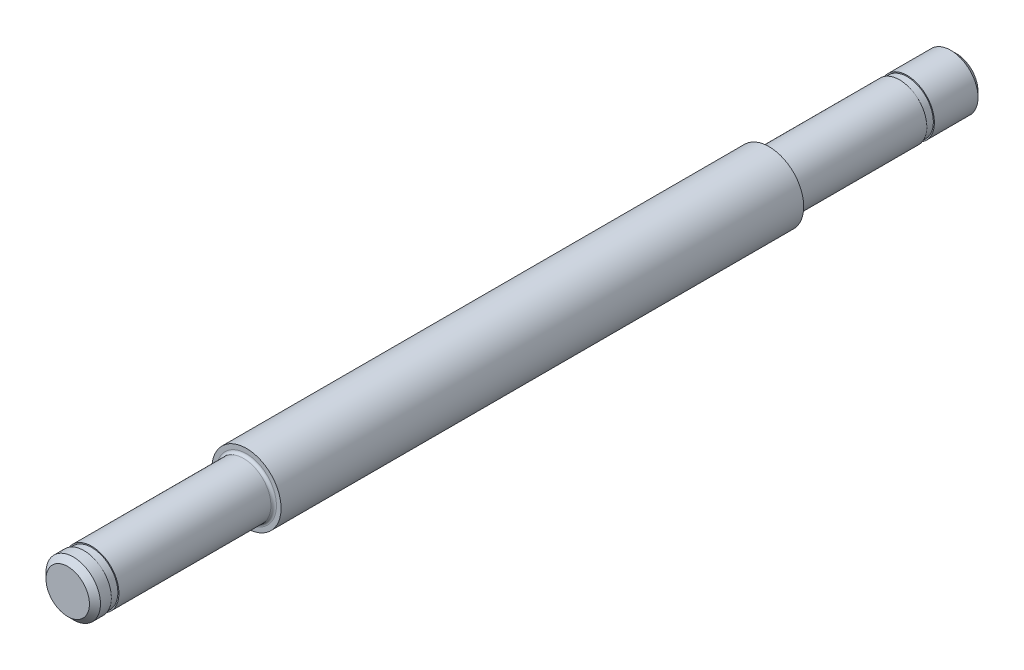
ISO-10303-21;
HEADER;
FILE_DESCRIPTION(('STEP AP214'),'2;1');
FILE_NAME('part.step','',(''),(''),'','','');
FILE_SCHEMA(('AUTOMOTIVE_DESIGN { 1 0 10303 214 1 1 1 1 }'));
ENDSEC;
DATA;
#1=APPLICATION_CONTEXT('core data for automotive mechanical design processes');
#2=APPLICATION_PROTOCOL_DEFINITION('international standard','automotive_design',2000,#1);
#3=PRODUCT_CONTEXT('',#1,'mechanical');
#4=PRODUCT('Part','Part','',(#3));
#5=PRODUCT_RELATED_PRODUCT_CATEGORY('part','',(#4));
#6=PRODUCT_DEFINITION_FORMATION('','',#4);
#7=PRODUCT_DEFINITION_CONTEXT('part definition',#1,'design');
#8=PRODUCT_DEFINITION('design','',#6,#7);
#9=PRODUCT_DEFINITION_SHAPE('','',#8);
#10=(LENGTH_UNIT() NAMED_UNIT(*) SI_UNIT(.MILLI.,.METRE.));
#11=(NAMED_UNIT(*) PLANE_ANGLE_UNIT() SI_UNIT($,.RADIAN.));
#12=(NAMED_UNIT(*) SI_UNIT($,.STERADIAN.) SOLID_ANGLE_UNIT());
#13=UNCERTAINTY_MEASURE_WITH_UNIT(LENGTH_MEASURE(1.E-05),#10,'distance_accuracy_value','');
#14=(GEOMETRIC_REPRESENTATION_CONTEXT(3) GLOBAL_UNCERTAINTY_ASSIGNED_CONTEXT((#13)) GLOBAL_UNIT_ASSIGNED_CONTEXT((#10,
#11,#12)) REPRESENTATION_CONTEXT('',''));
#15=CARTESIAN_POINT('',(0.,0.,0.));
#16=DIRECTION('',(0.,0.,1.));
#17=DIRECTION('',(1.,0.,0.));
#18=AXIS2_PLACEMENT_3D('',#15,#16,#17);
#19=CARTESIAN_POINT('',(0.,0.,40.767));
#20=DIRECTION('',(0.,0.,-1.));
#21=DIRECTION('',(-1.,0.,0.));
#22=AXIS2_PLACEMENT_3D('',#19,#20,#21);
#23=CYLINDRICAL_SURFACE('',#22,2.5);
#24=CARTESIAN_POINT('',(0.,0.,-23.8446445637161));
#25=DIRECTION('',(0.,0.,-1.));
#26=DIRECTION('',(-1.,0.,0.));
#27=AXIS2_PLACEMENT_3D('',#24,#25,#26);
#28=CIRCLE('',#27,2.5);
#29=CARTESIAN_POINT('',(-2.5,0.,-23.8446445637161));
#30=VERTEX_POINT('',#29);
#31=EDGE_CURVE('E48',#30,#30,#28,.T.);
#32=CARTESIAN_POINT('',(0.,0.,-35.5620027140689));
#33=DIRECTION('',(0.,0.,1.));
#34=DIRECTION('',(1.,0.,0.));
#35=AXIS2_PLACEMENT_3D('',#32,#33,#34);
#36=CIRCLE('',#35,2.5);
#37=CARTESIAN_POINT('',(-2.5,0.,-35.5620027140689));
#38=VERTEX_POINT('',#37);
#39=EDGE_CURVE('E86',#38,#38,#36,.T.);
#40=CARTESIAN_POINT('',(-2.5,0.,-23.8446445637161));
#41=CARTESIAN_POINT('',(-2.5,0.,-23.9667003777823));
#42=CARTESIAN_POINT('',(-2.5,0.,-24.0887561918485));
#43=CARTESIAN_POINT('',(-2.5,0.,-24.3328678199808));
#44=CARTESIAN_POINT('',(-2.5,0.,-24.454923634047));
#45=CARTESIAN_POINT('',(-2.5,0.,-24.6990352621793));
#46=CARTESIAN_POINT('',(-2.5,0.,-24.8210910762455));
#47=CARTESIAN_POINT('',(-2.5,0.,-25.0652027043778));
#48=CARTESIAN_POINT('',(-2.5,0.,-25.187258518444));
#49=CARTESIAN_POINT('',(-2.5,0.,-25.4313701465764));
#50=CARTESIAN_POINT('',(-2.5,0.,-25.5534259606426));
#51=CARTESIAN_POINT('',(-2.5,0.,-25.7975375887749));
#52=CARTESIAN_POINT('',(-2.5,0.,-25.9195934028411));
#53=CARTESIAN_POINT('',(-2.5,0.,-26.1637050309734));
#54=CARTESIAN_POINT('',(-2.5,0.,-26.2857608450396));
#55=CARTESIAN_POINT('',(-2.5,0.,-26.529872473172));
#56=CARTESIAN_POINT('',(-2.5,0.,-26.6519282872381));
#57=CARTESIAN_POINT('',(-2.5,0.,-26.8960399153705));
#58=CARTESIAN_POINT('',(-2.5,0.,-27.0180957294367));
#59=CARTESIAN_POINT('',(-2.5,0.,-27.262207357569));
#60=CARTESIAN_POINT('',(-2.5,0.,-27.3842631716352));
#61=CARTESIAN_POINT('',(-2.5,0.,-27.6283747997675));
#62=CARTESIAN_POINT('',(-2.5,0.,-27.7504306138337));
#63=CARTESIAN_POINT('',(-2.5,0.,-27.9945422419661));
#64=CARTESIAN_POINT('',(-2.5,0.,-28.1165980560322));
#65=CARTESIAN_POINT('',(-2.5,0.,-28.3607096841646));
#66=CARTESIAN_POINT('',(-2.5,0.,-28.4827654982308));
#67=CARTESIAN_POINT('',(-2.5,0.,-28.7268771263631));
#68=CARTESIAN_POINT('',(-2.5,0.,-28.8489329404293));
#69=CARTESIAN_POINT('',(-2.5,0.,-29.0930445685616));
#70=CARTESIAN_POINT('',(-2.5,0.,-29.2151003826278));
#71=CARTESIAN_POINT('',(-2.5,0.,-29.4592120107602));
#72=CARTESIAN_POINT('',(-2.5,0.,-29.5812678248263));
#73=CARTESIAN_POINT('',(-2.5,0.,-29.8253794529587));
#74=CARTESIAN_POINT('',(-2.5,0.,-29.9474352670249));
#75=CARTESIAN_POINT('',(-2.5,0.,-30.1915468951572));
#76=CARTESIAN_POINT('',(-2.5,0.,-30.3136027092234));
#77=CARTESIAN_POINT('',(-2.5,0.,-30.5577143373557));
#78=CARTESIAN_POINT('',(-2.5,0.,-30.6797701514219));
#79=CARTESIAN_POINT('',(-2.5,0.,-30.9238817795543));
#80=CARTESIAN_POINT('',(-2.5,0.,-31.0459375936204));
#81=CARTESIAN_POINT('',(-2.5,0.,-31.2900492217528));
#82=CARTESIAN_POINT('',(-2.5,0.,-31.412105035819));
#83=CARTESIAN_POINT('',(-2.5,0.,-31.6562166639513));
#84=CARTESIAN_POINT('',(-2.5,0.,-31.7782724780175));
#85=CARTESIAN_POINT('',(-2.5,0.,-32.0223841061498));
#86=CARTESIAN_POINT('',(-2.5,0.,-32.144439920216));
#87=CARTESIAN_POINT('',(-2.5,0.,-32.3885515483484));
#88=CARTESIAN_POINT('',(-2.5,0.,-32.5106073624145));
#89=CARTESIAN_POINT('',(-2.5,0.,-32.7547189905469));
#90=CARTESIAN_POINT('',(-2.5,0.,-32.8767748046131));
#91=CARTESIAN_POINT('',(-2.5,0.,-33.1208864327454));
#92=CARTESIAN_POINT('',(-2.5,0.,-33.2429422468116));
#93=CARTESIAN_POINT('',(-2.5,0.,-33.4870538749439));
#94=CARTESIAN_POINT('',(-2.5,0.,-33.6091096890101));
#95=CARTESIAN_POINT('',(-2.5,0.,-33.8532213171425));
#96=CARTESIAN_POINT('',(-2.5,0.,-33.9752771312086));
#97=CARTESIAN_POINT('',(-2.5,0.,-34.219388759341));
#98=CARTESIAN_POINT('',(-2.5,0.,-34.3414445734072));
#99=CARTESIAN_POINT('',(-2.5,0.,-34.5855562015395));
#100=CARTESIAN_POINT('',(-2.5,0.,-34.7076120156057));
#101=CARTESIAN_POINT('',(-2.5,0.,-34.951723643738));
#102=CARTESIAN_POINT('',(-2.5,0.,-35.0737794578042));
#103=CARTESIAN_POINT('',(-2.5,0.,-35.3178910859366));
#104=CARTESIAN_POINT('',(-2.5,0.,-35.4399469000027));
#105=CARTESIAN_POINT('',(-2.5,0.,-35.5620027140689));
#106=B_SPLINE_CURVE_WITH_KNOTS('',3,(#40,#41,#42,#43,#44,#45,#46,#47,#48,#49,#50,#51,#52,#53,
#54,#55,#56,#57,#58,#59,#60,#61,#62,#63,#64,#65,#66,#67,#68,#69,#70,#71,#72,#73,#74,#75,#76,#77,
#78,#79,#80,#81,#82,#83,#84,#85,#86,#87,#88,#89,#90,#91,#92,#93,#94,#95,#96,#97,#98,#99,#100,
#101,#102,#103,#104,#105),.UNSPECIFIED.,.F.,.F.,(4,2,2,2,2,2,2,2,2,2,2,2,2,2,2,2,2,2,2,2,2,2,2,
2,2,2,2,2,2,2,2,2,4),(0.,0.366167442198528,0.732334884397057,1.09850232659557,1.4646697687941,
1.83083721099263,2.19700465319116,2.56317209538968,2.9293395375882,3.29550697978673,
3.66167442198526,4.02784186418378,4.39400930638231,4.76017674858084,5.12634419077936,
5.49251163297788,5.85867907517641,6.22484651737494,6.59101395957347,6.95718140177198,
7.32334884397051,7.68951628616904,8.05568372836757,8.4218511705661,8.78801861276463,
9.15418605496314,9.52035349716167,9.8865209393602,10.2526883815587,10.6188558237572,
10.9850232659558,11.3511907081543,11.7173581503528),.UNSPECIFIED.);
#107=EDGE_CURVE('BSEAM33',#30,#38,#106,.T.);
#108=ORIENTED_EDGE('',*,*,#31,.T.);
#109=ORIENTED_EDGE('',*,*,#39,.T.);
#110=ORIENTED_EDGE('',*,*,#107,.T.);
#111=ORIENTED_EDGE('',*,*,#107,.F.);
#112=EDGE_LOOP('',(#108,#110,#109,#111));
#113=FACE_BOUND('',#112,.T.);
#114=ADVANCED_FACE('F33',(#113),#23,.T.);
#115=CARTESIAN_POINT('',(0.,0.,24.6185554362839));
#116=DIRECTION('',(0.,0.,-1.));
#117=DIRECTION('',(-1.,0.,0.));
#118=AXIS2_PLACEMENT_3D('',#115,#116,#117);
#119=CIRCLE('',#118,2.5);
#120=CARTESIAN_POINT('',(-2.5,0.,24.6185554362839));
#121=VERTEX_POINT('',#120);
#122=EDGE_CURVE('E10',#121,#121,#119,.F.);
#123=CARTESIAN_POINT('',(0.,0.,38.5645554362839));
#124=DIRECTION('',(0.,0.,1.));
#125=DIRECTION('',(1.,0.,0.));
#126=AXIS2_PLACEMENT_3D('',#123,#124,#125);
#127=CIRCLE('',#126,2.5);
#128=CARTESIAN_POINT('',(-2.5,0.,38.5645554362839));
#129=VERTEX_POINT('',#128);
#130=EDGE_CURVE('E71',#129,#129,#127,.T.);
#131=CARTESIAN_POINT('',(-2.5,0.,24.6185554362839));
#132=CARTESIAN_POINT('',(-2.5,0.,24.7638262696172));
#133=CARTESIAN_POINT('',(-2.5,0.,24.9090971029506));
#134=CARTESIAN_POINT('',(-2.5,0.,25.1996387696172));
#135=CARTESIAN_POINT('',(-2.5,0.,25.3449096029506));
#136=CARTESIAN_POINT('',(-2.5,0.,25.6354512696172));
#137=CARTESIAN_POINT('',(-2.5,0.,25.7807221029506));
#138=CARTESIAN_POINT('',(-2.5,0.,26.0712637696172));
#139=CARTESIAN_POINT('',(-2.5,0.,26.2165346029506));
#140=CARTESIAN_POINT('',(-2.5,0.,26.5070762696172));
#141=CARTESIAN_POINT('',(-2.5,0.,26.6523471029506));
#142=CARTESIAN_POINT('',(-2.5,0.,26.9428887696172));
#143=CARTESIAN_POINT('',(-2.5,0.,27.0881596029506));
#144=CARTESIAN_POINT('',(-2.5,0.,27.3787012696172));
#145=CARTESIAN_POINT('',(-2.5,0.,27.5239721029506));
#146=CARTESIAN_POINT('',(-2.5,0.,27.8145137696172));
#147=CARTESIAN_POINT('',(-2.5,0.,27.9597846029506));
#148=CARTESIAN_POINT('',(-2.5,0.,28.2503262696172));
#149=CARTESIAN_POINT('',(-2.5,0.,28.3955971029506));
#150=CARTESIAN_POINT('',(-2.5,0.,28.6861387696172));
#151=CARTESIAN_POINT('',(-2.5,0.,28.8314096029506));
#152=CARTESIAN_POINT('',(-2.5,0.,29.1219512696172));
#153=CARTESIAN_POINT('',(-2.5,0.,29.2672221029506));
#154=CARTESIAN_POINT('',(-2.5,0.,29.5577637696172));
#155=CARTESIAN_POINT('',(-2.5,0.,29.7030346029506));
#156=CARTESIAN_POINT('',(-2.5,0.,29.9935762696172));
#157=CARTESIAN_POINT('',(-2.5,0.,30.1388471029506));
#158=CARTESIAN_POINT('',(-2.5,0.,30.4293887696172));
#159=CARTESIAN_POINT('',(-2.5,0.,30.5746596029506));
#160=CARTESIAN_POINT('',(-2.5,0.,30.8652012696172));
#161=CARTESIAN_POINT('',(-2.5,0.,31.0104721029506));
#162=CARTESIAN_POINT('',(-2.5,0.,31.3010137696172));
#163=CARTESIAN_POINT('',(-2.5,0.,31.4462846029506));
#164=CARTESIAN_POINT('',(-2.5,0.,31.7368262696172));
#165=CARTESIAN_POINT('',(-2.5,0.,31.8820971029506));
#166=CARTESIAN_POINT('',(-2.5,0.,32.1726387696172));
#167=CARTESIAN_POINT('',(-2.5,0.,32.3179096029506));
#168=CARTESIAN_POINT('',(-2.5,0.,32.6084512696172));
#169=CARTESIAN_POINT('',(-2.5,0.,32.7537221029506));
#170=CARTESIAN_POINT('',(-2.5,0.,33.0442637696172));
#171=CARTESIAN_POINT('',(-2.5,0.,33.1895346029506));
#172=CARTESIAN_POINT('',(-2.5,0.,33.4800762696172));
#173=CARTESIAN_POINT('',(-2.5,0.,33.6253471029506));
#174=CARTESIAN_POINT('',(-2.5,0.,33.9158887696172));
#175=CARTESIAN_POINT('',(-2.5,0.,34.0611596029506));
#176=CARTESIAN_POINT('',(-2.5,0.,34.3517012696172));
#177=CARTESIAN_POINT('',(-2.5,0.,34.4969721029506));
#178=CARTESIAN_POINT('',(-2.5,0.,34.7875137696172));
#179=CARTESIAN_POINT('',(-2.5,0.,34.9327846029506));
#180=CARTESIAN_POINT('',(-2.5,0.,35.2233262696172));
#181=CARTESIAN_POINT('',(-2.5,0.,35.3685971029506));
#182=CARTESIAN_POINT('',(-2.5,0.,35.6591387696172));
#183=CARTESIAN_POINT('',(-2.5,0.,35.8044096029506));
#184=CARTESIAN_POINT('',(-2.5,0.,36.0949512696172));
#185=CARTESIAN_POINT('',(-2.5,0.,36.2402221029506));
#186=CARTESIAN_POINT('',(-2.5,0.,36.5307637696172));
#187=CARTESIAN_POINT('',(-2.5,0.,36.6760346029506));
#188=CARTESIAN_POINT('',(-2.5,0.,36.9665762696172));
#189=CARTESIAN_POINT('',(-2.5,0.,37.1118471029506));
#190=CARTESIAN_POINT('',(-2.5,0.,37.4023887696172));
#191=CARTESIAN_POINT('',(-2.5,0.,37.5476596029506));
#192=CARTESIAN_POINT('',(-2.5,0.,37.8382012696172));
#193=CARTESIAN_POINT('',(-2.5,0.,37.9834721029506));
#194=CARTESIAN_POINT('',(-2.5,0.,38.2740137696172));
#195=CARTESIAN_POINT('',(-2.5,0.,38.4192846029506));
#196=CARTESIAN_POINT('',(-2.5,0.,38.5645554362839));
#197=B_SPLINE_CURVE_WITH_KNOTS('',3,(#131,#132,#133,#134,#135,#136,#137,#138,#139,#140,#141,
#142,#143,#144,#145,#146,#147,#148,#149,#150,#151,#152,#153,#154,#155,#156,#157,#158,#159,#160,
#161,#162,#163,#164,#165,#166,#167,#168,#169,#170,#171,#172,#173,#174,#175,#176,#177,#178,#179,
#180,#181,#182,#183,#184,#185,#186,#187,#188,#189,#190,#191,#192,#193,#194,#195,#196),
.UNSPECIFIED.,.F.,.F.,(4,2,2,2,2,2,2,2,2,2,2,2,2,2,2,2,2,2,2,2,2,2,2,2,2,2,2,2,2,2,2,2,4),(0.,
0.4358125,0.871624999999997,1.3074375,1.74325,2.1790625,2.614875,3.0506875,3.4865,3.9223125,
4.358125,4.7939375,5.22975,5.6655625,6.101375,6.5371875,6.973,7.4088125,7.844625,8.2804375,
8.71625,9.1520625,9.587875,10.0236875,10.4595,10.8953125,11.331125,11.7669375,12.20275,
12.6385625,13.074375,13.5101875,13.946),.UNSPECIFIED.);
#198=EDGE_CURVE('BSEAM115',#121,#129,#197,.T.);
#199=ORIENTED_EDGE('',*,*,#122,.T.);
#200=ORIENTED_EDGE('',*,*,#130,.F.);
#201=ORIENTED_EDGE('',*,*,#198,.T.);
#202=ORIENTED_EDGE('',*,*,#198,.F.);
#203=EDGE_LOOP('',(#199,#201,#200,#202));
#204=FACE_BOUND('',#203,.T.);
#205=ADVANCED_FACE('F115',(#204),#23,.T.);
#206=CARTESIAN_POINT('',(0.,0.,40.259));
#207=DIRECTION('',(0.,0.,1.));
#208=DIRECTION('',(1.,0.,0.));
#209=AXIS2_PLACEMENT_3D('',#206,#207,#208);
#210=CIRCLE('',#209,2.5);
#211=CARTESIAN_POINT('',(-2.5,0.,40.259));
#212=VERTEX_POINT('',#211);
#213=EDGE_CURVE('E59',#212,#212,#210,.F.);
#214=CARTESIAN_POINT('',(0.,0.,39.2645554362839));
#215=DIRECTION('',(0.,0.,1.));
#216=DIRECTION('',(1.,0.,0.));
#217=AXIS2_PLACEMENT_3D('',#214,#215,#216);
#218=CIRCLE('',#217,2.5);
#219=CARTESIAN_POINT('',(-2.5,0.,39.2645554362839));
#220=VERTEX_POINT('',#219);
#221=EDGE_CURVE('E74',#220,#220,#218,.T.);
#222=CARTESIAN_POINT('',(-2.5,0.,40.259));
#223=CARTESIAN_POINT('',(-2.5,0.,40.2486412024613));
#224=CARTESIAN_POINT('',(-2.5,0.,40.2382824049226));
#225=CARTESIAN_POINT('',(-2.5,0.,40.2175648098452));
#226=CARTESIAN_POINT('',(-2.5,0.,40.2072060123065));
#227=CARTESIAN_POINT('',(-2.5,0.,40.186488417229));
#228=CARTESIAN_POINT('',(-2.5,0.,40.1761296196903));
#229=CARTESIAN_POINT('',(-2.5,0.,40.1554120246129));
#230=CARTESIAN_POINT('',(-2.5,0.,40.1450532270742));
#231=CARTESIAN_POINT('',(-2.5,0.,40.1243356319968));
#232=CARTESIAN_POINT('',(-2.5,0.,40.1139768344581));
#233=CARTESIAN_POINT('',(-2.5,0.,40.0932592393806));
#234=CARTESIAN_POINT('',(-2.5,0.,40.0829004418419));
#235=CARTESIAN_POINT('',(-2.5,0.,40.0621828467645));
#236=CARTESIAN_POINT('',(-2.5,0.,40.0518240492258));
#237=CARTESIAN_POINT('',(-2.5,0.,40.0311064541484));
#238=CARTESIAN_POINT('',(-2.5,0.,40.0207476566097));
#239=CARTESIAN_POINT('',(-2.5,0.,40.0000300615323));
#240=CARTESIAN_POINT('',(-2.5,0.,39.9896712639936));
#241=CARTESIAN_POINT('',(-2.5,0.,39.9689536689161));
#242=CARTESIAN_POINT('',(-2.5,0.,39.9585948713774));
#243=CARTESIAN_POINT('',(-2.5,0.,39.9378772763));
#244=CARTESIAN_POINT('',(-2.5,0.,39.9275184787613));
#245=CARTESIAN_POINT('',(-2.5,0.,39.9068008836839));
#246=CARTESIAN_POINT('',(-2.5,0.,39.8964420861452));
#247=CARTESIAN_POINT('',(-2.5,0.,39.8757244910677));
#248=CARTESIAN_POINT('',(-2.5,0.,39.865365693529));
#249=CARTESIAN_POINT('',(-2.5,0.,39.8446480984516));
#250=CARTESIAN_POINT('',(-2.5,0.,39.8342893009129));
#251=CARTESIAN_POINT('',(-2.5,0.,39.8135717058355));
#252=CARTESIAN_POINT('',(-2.5,0.,39.8032129082968));
#253=CARTESIAN_POINT('',(-2.5,0.,39.7824953132194));
#254=CARTESIAN_POINT('',(-2.5,0.,39.7721365156807));
#255=CARTESIAN_POINT('',(-2.5,0.,39.7514189206032));
#256=CARTESIAN_POINT('',(-2.5,0.,39.7410601230645));
#257=CARTESIAN_POINT('',(-2.5,0.,39.7203425279871));
#258=CARTESIAN_POINT('',(-2.5,0.,39.7099837304484));
#259=CARTESIAN_POINT('',(-2.5,0.,39.689266135371));
#260=CARTESIAN_POINT('',(-2.5,0.,39.6789073378323));
#261=CARTESIAN_POINT('',(-2.5,0.,39.6581897427549));
#262=CARTESIAN_POINT('',(-2.5,0.,39.6478309452161));
#263=CARTESIAN_POINT('',(-2.5,0.,39.6271133501387));
#264=CARTESIAN_POINT('',(-2.5,0.,39.6167545526));
#265=CARTESIAN_POINT('',(-2.5,0.,39.5960369575226));
#266=CARTESIAN_POINT('',(-2.5,0.,39.5856781599839));
#267=CARTESIAN_POINT('',(-2.5,0.,39.5649605649065));
#268=CARTESIAN_POINT('',(-2.5,0.,39.5546017673678));
#269=CARTESIAN_POINT('',(-2.5,0.,39.5338841722903));
#270=CARTESIAN_POINT('',(-2.5,0.,39.5235253747516));
#271=CARTESIAN_POINT('',(-2.5,0.,39.5028077796742));
#272=CARTESIAN_POINT('',(-2.5,0.,39.4924489821355));
#273=CARTESIAN_POINT('',(-2.5,0.,39.4717313870581));
#274=CARTESIAN_POINT('',(-2.5,0.,39.4613725895194));
#275=CARTESIAN_POINT('',(-2.5,0.,39.440654994442));
#276=CARTESIAN_POINT('',(-2.5,0.,39.4302961969033));
#277=CARTESIAN_POINT('',(-2.5,0.,39.4095786018258));
#278=CARTESIAN_POINT('',(-2.5,0.,39.3992198042871));
#279=CARTESIAN_POINT('',(-2.5,0.,39.3785022092097));
#280=CARTESIAN_POINT('',(-2.5,0.,39.368143411671));
#281=CARTESIAN_POINT('',(-2.5,0.,39.3474258165936));
#282=CARTESIAN_POINT('',(-2.5,0.,39.3370670190549));
#283=CARTESIAN_POINT('',(-2.5,0.,39.3163494239774));
#284=CARTESIAN_POINT('',(-2.5,0.,39.3059906264387));
#285=CARTESIAN_POINT('',(-2.5,0.,39.2852730313613));
#286=CARTESIAN_POINT('',(-2.5,0.,39.2749142338226));
#287=CARTESIAN_POINT('',(-2.5,0.,39.2645554362839));
#288=B_SPLINE_CURVE_WITH_KNOTS('',3,(#222,#223,#224,#225,#226,#227,#228,#229,#230,#231,#232,
#233,#234,#235,#236,#237,#238,#239,#240,#241,#242,#243,#244,#245,#246,#247,#248,#249,#250,#251,
#252,#253,#254,#255,#256,#257,#258,#259,#260,#261,#262,#263,#264,#265,#266,#267,#268,#269,#270,
#271,#272,#273,#274,#275,#276,#277,#278,#279,#280,#281,#282,#283,#284,#285,#286,#287),
.UNSPECIFIED.,.F.,.F.,(4,2,2,2,2,2,2,2,2,2,2,2,2,2,2,2,2,2,2,2,2,2,2,2,2,2,2,2,2,2,2,2,4),(0.,
0.031076392616125,0.0621527852322501,0.0932291778483821,0.124305570464507,0.155381963080639,
0.186458355696764,0.217534748312896,0.248611140929021,0.279687533545146,0.310763926161278,
0.341840318777403,0.372916711393535,0.40399310400966,0.435069496625792,0.466145889241917,
0.497222281858049,0.528298674474174,0.559375067090299,0.590451459706431,0.621527852322556,
0.652604244938688,0.683680637554813,0.714757030170945,0.745833422787071,0.776909815403196,
0.807986208019328,0.839062600635453,0.870138993251585,0.90121538586771,0.932291778483842,
0.963368171099967,0.994444563716099),.UNSPECIFIED.);
#289=EDGE_CURVE('BSEAM123',#212,#220,#288,.T.);
#290=ORIENTED_EDGE('',*,*,#213,.T.);
#291=ORIENTED_EDGE('',*,*,#221,.T.);
#292=ORIENTED_EDGE('',*,*,#289,.T.);
#293=ORIENTED_EDGE('',*,*,#289,.F.);
#294=EDGE_LOOP('',(#290,#292,#291,#293));
#295=FACE_BOUND('',#294,.T.);
#296=ADVANCED_FACE('F123',(#295),#23,.T.);
#297=CARTESIAN_POINT('',(0.,0.,40.767));
#298=DIRECTION('',(0.,0.,1.));
#299=DIRECTION('',(1.,0.,0.));
#300=AXIS2_PLACEMENT_3D('',#297,#298,#299);
#301=PLANE('',#300);
#302=CARTESIAN_POINT('',(0.,0.,40.767));
#303=DIRECTION('',(0.,0.,1.));
#304=DIRECTION('',(1.,0.,0.));
#305=AXIS2_PLACEMENT_3D('',#302,#303,#304);
#306=CIRCLE('',#305,1.99200000000002);
#307=CARTESIAN_POINT('',(1.99200000000002,0.,40.767));
#308=VERTEX_POINT('',#307);
#309=EDGE_CURVE('E62',#308,#308,#306,.T.);
#310=ORIENTED_EDGE('',*,*,#309,.T.);
#311=EDGE_LOOP('',(#310));
#312=FACE_BOUND('',#311,.T.);
#313=ADVANCED_FACE('F141',(#312),#301,.T.);
#314=CARTESIAN_POINT('',(0.,2.5,39.2645554362839));
#315=DIRECTION('',(0.,0.,-1.));
#316=DIRECTION('',(-1.,0.,0.));
#317=AXIS2_PLACEMENT_3D('',#314,#315,#316);
#318=PLANE('',#317);
#319=CARTESIAN_POINT('',(0.,0.,39.2645554362839));
#320=DIRECTION('',(0.,0.,1.));
#321=DIRECTION('',(1.,0.,0.));
#322=AXIS2_PLACEMENT_3D('',#319,#320,#321);
#323=CIRCLE('',#322,2.4);
#324=CARTESIAN_POINT('',(2.4,0.,39.2645554362839));
#325=VERTEX_POINT('',#324);
#326=EDGE_CURVE('E65',#325,#325,#323,.T.);
#327=ORIENTED_EDGE('',*,*,#326,.T.);
#328=EDGE_LOOP('',(#327));
#329=FACE_BOUND('',#328,.T.);
#330=ORIENTED_EDGE('',*,*,#221,.F.);
#331=EDGE_LOOP('',(#330));
#332=FACE_BOUND('',#331,.T.);
#333=ADVANCED_FACE('F147',(#329,#332),#318,.T.);
#334=CARTESIAN_POINT('',(0.,0.,40.767));
#335=DIRECTION('',(0.,0.,1.));
#336=DIRECTION('',(1.,0.,0.));
#337=AXIS2_PLACEMENT_3D('',#334,#335,#336);
#338=CYLINDRICAL_SURFACE('',#337,2.4);
#339=CARTESIAN_POINT('',(0.,0.,38.5645554362839));
#340=DIRECTION('',(0.,0.,1.));
#341=DIRECTION('',(1.,0.,0.));
#342=AXIS2_PLACEMENT_3D('',#339,#340,#341);
#343=CIRCLE('',#342,2.4);
#344=CARTESIAN_POINT('',(2.4,0.,38.5645554362839));
#345=VERTEX_POINT('',#344);
#346=EDGE_CURVE('E68',#345,#345,#343,.T.);
#347=ORIENTED_EDGE('',*,*,#346,.T.);
#348=EDGE_LOOP('',(#347));
#349=FACE_BOUND('',#348,.T.);
#350=ORIENTED_EDGE('',*,*,#326,.F.);
#351=EDGE_LOOP('',(#350));
#352=FACE_BOUND('',#351,.T.);
#353=ADVANCED_FACE('F155',(#349,#352),#338,.T.);
#354=CARTESIAN_POINT('',(0.,2.5,38.5645554362839));
#355=DIRECTION('',(0.,0.,1.));
#356=DIRECTION('',(1.,0.,0.));
#357=AXIS2_PLACEMENT_3D('',#354,#355,#356);
#358=PLANE('',#357);
#359=ORIENTED_EDGE('',*,*,#130,.T.);
#360=EDGE_LOOP('',(#359));
#361=FACE_BOUND('',#360,.T.);
#362=ORIENTED_EDGE('',*,*,#346,.F.);
#363=EDGE_LOOP('',(#362));
#364=FACE_BOUND('',#363,.T.);
#365=ADVANCED_FACE('F161',(#361,#364),#358,.T.);
#366=CARTESIAN_POINT('',(0.,0.,-23.5906445637161));
#367=DIRECTION('',(0.,0.,1.));
#368=DIRECTION('',(1.,0.,0.));
#369=AXIS2_PLACEMENT_3D('',#366,#367,#368);
#370=CYLINDRICAL_SURFACE('',#369,3.175);
#371=CARTESIAN_POINT('',(0.,0.,-23.5906445637161));
#372=DIRECTION('',(0.,0.,-1.));
#373=DIRECTION('',(-1.,0.,0.));
#374=AXIS2_PLACEMENT_3D('',#371,#372,#373);
#375=CIRCLE('',#374,3.175);
#376=CARTESIAN_POINT('',(3.175,0.,-23.5906445637161));
#377=VERTEX_POINT('',#376);
#378=EDGE_CURVE('E77',#377,#377,#375,.T.);
#379=CARTESIAN_POINT('',(0.,0.,24.3645554362839));
#380=DIRECTION('',(0.,0.,-1.));
#381=DIRECTION('',(-1.,0.,0.));
#382=AXIS2_PLACEMENT_3D('',#379,#380,#381);
#383=CIRCLE('',#382,3.175);
#384=CARTESIAN_POINT('',(3.175,0.,24.3645554362839));
#385=VERTEX_POINT('',#384);
#386=EDGE_CURVE('E78',#385,#385,#383,.T.);
#387=CARTESIAN_POINT('',(3.175,0.,-23.5906445637161));
#388=CARTESIAN_POINT('',(3.175,0.,-23.0911112303828));
#389=CARTESIAN_POINT('',(3.175,0.,-22.5915778970494));
#390=CARTESIAN_POINT('',(3.175,0.,-21.5925112303828));
#391=CARTESIAN_POINT('',(3.175,0.,-21.0929778970494));
#392=CARTESIAN_POINT('',(3.175,0.,-20.0939112303828));
#393=CARTESIAN_POINT('',(3.175,0.,-19.5943778970494));
#394=CARTESIAN_POINT('',(3.175,0.,-18.5953112303828));
#395=CARTESIAN_POINT('',(3.175,0.,-18.0957778970494));
#396=CARTESIAN_POINT('',(3.175,0.,-17.0967112303828));
#397=CARTESIAN_POINT('',(3.175,0.,-16.5971778970494));
#398=CARTESIAN_POINT('',(3.175,0.,-15.5981112303828));
#399=CARTESIAN_POINT('',(3.175,0.,-15.0985778970494));
#400=CARTESIAN_POINT('',(3.175,0.,-14.0995112303828));
#401=CARTESIAN_POINT('',(3.175,0.,-13.5999778970494));
#402=CARTESIAN_POINT('',(3.175,0.,-12.6009112303828));
#403=CARTESIAN_POINT('',(3.175,0.,-12.1013778970494));
#404=CARTESIAN_POINT('',(3.175,0.,-11.1023112303828));
#405=CARTESIAN_POINT('',(3.175,0.,-10.6027778970494));
#406=CARTESIAN_POINT('',(3.175,0.,-9.60371123038277));
#407=CARTESIAN_POINT('',(3.175,0.,-9.10417789704943));
#408=CARTESIAN_POINT('',(3.175,0.,-8.10511123038276));
#409=CARTESIAN_POINT('',(3.175,0.,-7.60557789704943));
#410=CARTESIAN_POINT('',(3.175,0.,-6.60651123038277));
#411=CARTESIAN_POINT('',(3.175,0.,-6.10697789704943));
#412=CARTESIAN_POINT('',(3.175,0.,-5.10791123038277));
#413=CARTESIAN_POINT('',(3.175,0.,-4.60837789704943));
#414=CARTESIAN_POINT('',(3.175,0.,-3.60931123038277));
#415=CARTESIAN_POINT('',(3.175,0.,-3.10977789704943));
#416=CARTESIAN_POINT('',(3.175,0.,-2.11071123038277));
#417=CARTESIAN_POINT('',(3.175,0.,-1.61117789704943));
#418=CARTESIAN_POINT('',(3.175,0.,-0.612111230382767));
#419=CARTESIAN_POINT('',(3.175,0.,-0.112577897049434));
#420=CARTESIAN_POINT('',(3.175,0.,0.886488769617232));
#421=CARTESIAN_POINT('',(3.175,0.,1.38602210295057));
#422=CARTESIAN_POINT('',(3.175,0.,2.38508876961723));
#423=CARTESIAN_POINT('',(3.175,0.,2.88462210295056));
#424=CARTESIAN_POINT('',(3.175,0.,3.88368876961723));
#425=CARTESIAN_POINT('',(3.175,0.,4.38322210295057));
#426=CARTESIAN_POINT('',(3.175,0.,5.38228876961723));
#427=CARTESIAN_POINT('',(3.175,0.,5.88182210295057));
#428=CARTESIAN_POINT('',(3.175,0.,6.88088876961723));
#429=CARTESIAN_POINT('',(3.175,0.,7.38042210295057));
#430=CARTESIAN_POINT('',(3.175,0.,8.37948876961723));
#431=CARTESIAN_POINT('',(3.175,0.,8.87902210295057));
#432=CARTESIAN_POINT('',(3.175,0.,9.87808876961723));
#433=CARTESIAN_POINT('',(3.175,0.,10.3776221029506));
#434=CARTESIAN_POINT('',(3.175,0.,11.3766887696172));
#435=CARTESIAN_POINT('',(3.175,0.,11.8762221029506));
#436=CARTESIAN_POINT('',(3.175,0.,12.8752887696172));
#437=CARTESIAN_POINT('',(3.175,0.,13.3748221029506));
#438=CARTESIAN_POINT('',(3.175,0.,14.3738887696172));
#439=CARTESIAN_POINT('',(3.175,0.,14.8734221029506));
#440=CARTESIAN_POINT('',(3.175,0.,15.8724887696172));
#441=CARTESIAN_POINT('',(3.175,0.,16.3720221029506));
#442=CARTESIAN_POINT('',(3.175,0.,17.3710887696172));
#443=CARTESIAN_POINT('',(3.175,0.,17.8706221029506));
#444=CARTESIAN_POINT('',(3.175,0.,18.8696887696172));
#445=CARTESIAN_POINT('',(3.175,0.,19.3692221029506));
#446=CARTESIAN_POINT('',(3.175,0.,20.3682887696172));
#447=CARTESIAN_POINT('',(3.175,0.,20.8678221029506));
#448=CARTESIAN_POINT('',(3.175,0.,21.8668887696172));
#449=CARTESIAN_POINT('',(3.175,0.,22.3664221029506));
#450=CARTESIAN_POINT('',(3.175,0.,23.3654887696172));
#451=CARTESIAN_POINT('',(3.175,0.,23.8650221029506));
#452=CARTESIAN_POINT('',(3.175,0.,24.3645554362839));
#453=B_SPLINE_CURVE_WITH_KNOTS('',3,(#387,#388,#389,#390,#391,#392,#393,#394,#395,#396,#397,
#398,#399,#400,#401,#402,#403,#404,#405,#406,#407,#408,#409,#410,#411,#412,#413,#414,#415,#416,
#417,#418,#419,#420,#421,#422,#423,#424,#425,#426,#427,#428,#429,#430,#431,#432,#433,#434,#435,
#436,#437,#438,#439,#440,#441,#442,#443,#444,#445,#446,#447,#448,#449,#450,#451,#452),
.UNSPECIFIED.,.F.,.F.,(4,2,2,2,2,2,2,2,2,2,2,2,2,2,2,2,2,2,2,2,2,2,2,2,2,2,2,2,2,2,2,2,4),(0.,
1.4986,2.9972,4.4958,5.9944,7.493,8.9916,10.4902,11.9888,13.4874,14.986,16.4846,17.9832,19.4818,
20.9804,22.479,23.9776,25.4762,26.9748,28.4734,29.972,31.4706,32.9692,34.4678,35.9664,37.465,
38.9636,40.4622,41.9608,43.4594,44.958,46.4566,47.9552),.UNSPECIFIED.);
#454=EDGE_CURVE('BSEAM167',#377,#385,#453,.T.);
#455=ORIENTED_EDGE('',*,*,#378,.F.);
#456=ORIENTED_EDGE('',*,*,#386,.T.);
#457=ORIENTED_EDGE('',*,*,#454,.T.);
#458=ORIENTED_EDGE('',*,*,#454,.F.);
#459=EDGE_LOOP('',(#455,#457,#456,#458));
#460=FACE_BOUND('',#459,.T.);
#461=ADVANCED_FACE('F167',(#460),#370,.T.);
#462=CARTESIAN_POINT('',(0.,0.,-23.5906445637161));
#463=DIRECTION('',(0.,0.,-1.));
#464=DIRECTION('',(-1.,0.,0.));
#465=AXIS2_PLACEMENT_3D('',#462,#463,#464);
#466=PLANE('',#465);
#467=CARTESIAN_POINT('',(0.,0.,-23.5906445637161));
#468=DIRECTION('',(0.,0.,-1.));
#469=DIRECTION('',(-1.,0.,0.));
#470=AXIS2_PLACEMENT_3D('',#467,#468,#469);
#471=CIRCLE('',#470,2.754);
#472=CARTESIAN_POINT('',(-2.754,0.,-23.5906445637161));
#473=VERTEX_POINT('',#472);
#474=EDGE_CURVE('E44',#473,#473,#471,.F.);
#475=ORIENTED_EDGE('',*,*,#474,.T.);
#476=EDGE_LOOP('',(#475));
#477=FACE_BOUND('',#476,.T.);
#478=ORIENTED_EDGE('',*,*,#378,.T.);
#479=EDGE_LOOP('',(#478));
#480=FACE_BOUND('',#479,.T.);
#481=ADVANCED_FACE('F111',(#477,#480),#466,.T.);
#482=CARTESIAN_POINT('',(0.,0.,24.3645554362839));
#483=DIRECTION('',(0.,0.,-1.));
#484=DIRECTION('',(-1.,0.,0.));
#485=AXIS2_PLACEMENT_3D('',#482,#483,#484);
#486=PLANE('',#485);
#487=CARTESIAN_POINT('',(0.,0.,24.3645554362839));
#488=DIRECTION('',(0.,0.,-1.));
#489=DIRECTION('',(-1.,0.,0.));
#490=AXIS2_PLACEMENT_3D('',#487,#488,#489);
#491=CIRCLE('',#490,2.754);
#492=CARTESIAN_POINT('',(-2.754,0.,24.3645554362839));
#493=VERTEX_POINT('',#492);
#494=EDGE_CURVE('E40',#493,#493,#491,.T.);
#495=ORIENTED_EDGE('',*,*,#494,.T.);
#496=EDGE_LOOP('',(#495));
#497=FACE_BOUND('',#496,.T.);
#498=ORIENTED_EDGE('',*,*,#386,.F.);
#499=EDGE_LOOP('',(#498));
#500=FACE_BOUND('',#499,.T.);
#501=ADVANCED_FACE('F102',(#497,#500),#486,.F.);
#502=CARTESIAN_POINT('',(0.,2.4,-36.2620027140689));
#503=DIRECTION('',(0.,0.,1.));
#504=DIRECTION('',(1.,0.,0.));
#505=AXIS2_PLACEMENT_3D('',#502,#503,#504);
#506=PLANE('',#505);
#507=CARTESIAN_POINT('',(0.,0.,-36.2620027140689));
#508=DIRECTION('',(0.,0.,1.));
#509=DIRECTION('',(1.,0.,0.));
#510=AXIS2_PLACEMENT_3D('',#507,#508,#509);
#511=CIRCLE('',#510,2.5);
#512=CARTESIAN_POINT('',(-2.5,0.,-36.2620027140689));
#513=VERTEX_POINT('',#512);
#514=EDGE_CURVE('E81',#513,#513,#511,.T.);
#515=ORIENTED_EDGE('',*,*,#514,.T.);
#516=EDGE_LOOP('',(#515));
#517=FACE_BOUND('',#516,.T.);
#518=CARTESIAN_POINT('',(0.,0.,-36.2620027140689));
#519=DIRECTION('',(0.,0.,1.));
#520=DIRECTION('',(1.,0.,0.));
#521=AXIS2_PLACEMENT_3D('',#518,#519,#520);
#522=CIRCLE('',#521,2.4);
#523=CARTESIAN_POINT('',(2.4,0.,-36.2620027140689));
#524=VERTEX_POINT('',#523);
#525=EDGE_CURVE('E92',#524,#524,#522,.T.);
#526=ORIENTED_EDGE('',*,*,#525,.F.);
#527=EDGE_LOOP('',(#526));
#528=FACE_BOUND('',#527,.T.);
#529=ADVANCED_FACE('F99',(#517,#528),#506,.T.);
#530=CARTESIAN_POINT('',(0.,2.4,-35.5620027140689));
#531=DIRECTION('',(0.,0.,-1.));
#532=DIRECTION('',(-1.,0.,0.));
#533=AXIS2_PLACEMENT_3D('',#530,#531,#532);
#534=PLANE('',#533);
#535=CARTESIAN_POINT('',(0.,0.,-35.5620027140689));
#536=DIRECTION('',(0.,0.,1.));
#537=DIRECTION('',(1.,0.,0.));
#538=AXIS2_PLACEMENT_3D('',#535,#536,#537);
#539=CIRCLE('',#538,2.4);
#540=CARTESIAN_POINT('',(2.4,0.,-35.5620027140689));
#541=VERTEX_POINT('',#540);
#542=EDGE_CURVE('E89',#541,#541,#539,.T.);
#543=ORIENTED_EDGE('',*,*,#542,.T.);
#544=EDGE_LOOP('',(#543));
#545=FACE_BOUND('',#544,.T.);
#546=ORIENTED_EDGE('',*,*,#39,.F.);
#547=EDGE_LOOP('',(#546));
#548=FACE_BOUND('',#547,.T.);
#549=ADVANCED_FACE('F101',(#545,#548),#534,.T.);
#550=CARTESIAN_POINT('',(0.,0.,-23.5906445637161));
#551=DIRECTION('',(0.,0.,1.));
#552=DIRECTION('',(1.,0.,0.));
#553=AXIS2_PLACEMENT_3D('',#550,#551,#552);
#554=CYLINDRICAL_SURFACE('',#553,2.4);
#555=ORIENTED_EDGE('',*,*,#525,.T.);
#556=EDGE_LOOP('',(#555));
#557=FACE_BOUND('',#556,.T.);
#558=ORIENTED_EDGE('',*,*,#542,.F.);
#559=EDGE_LOOP('',(#558));
#560=FACE_BOUND('',#559,.T.);
#561=ADVANCED_FACE('F96',(#557,#560),#554,.T.);
#562=CARTESIAN_POINT('',(0.,0.,-40.767));
#563=DIRECTION('',(0.,0.,1.));
#564=DIRECTION('',(1.,0.,0.));
#565=AXIS2_PLACEMENT_3D('',#562,#563,#564);
#566=PLANE('',#565);
#567=CARTESIAN_POINT('',(0.,0.,-40.767));
#568=DIRECTION('',(0.,0.,1.));
#569=DIRECTION('',(1.,0.,0.));
#570=AXIS2_PLACEMENT_3D('',#567,#568,#569);
#571=CIRCLE('',#570,1.99199999999992);
#572=CARTESIAN_POINT('',(1.99199999999992,0.,-40.767));
#573=VERTEX_POINT('',#572);
#574=EDGE_CURVE('E53',#573,#573,#571,.F.);
#575=ORIENTED_EDGE('',*,*,#574,.T.);
#576=EDGE_LOOP('',(#575));
#577=FACE_BOUND('',#576,.T.);
#578=ADVANCED_FACE('F129',(#577),#566,.F.);
#579=CARTESIAN_POINT('',(0.,0.,-40.2589999999999));
#580=DIRECTION('',(0.,0.,1.));
#581=DIRECTION('',(1.,0.,0.));
#582=AXIS2_PLACEMENT_3D('',#579,#580,#581);
#583=CIRCLE('',#582,2.5);
#584=CARTESIAN_POINT('',(-2.5,0.,-40.2589999999999));
#585=VERTEX_POINT('',#584);
#586=EDGE_CURVE('E56',#585,#585,#583,.T.);
#587=CARTESIAN_POINT('',(-2.5,0.,-40.2589999999999));
#588=CARTESIAN_POINT('',(-2.5,0.,-40.2173646116048));
#589=CARTESIAN_POINT('',(-2.5,0.,-40.1757292232097));
#590=CARTESIAN_POINT('',(-2.5,0.,-40.0924584464194));
#591=CARTESIAN_POINT('',(-2.5,0.,-40.0508230580243));
#592=CARTESIAN_POINT('',(-2.5,0.,-39.9675522812341));
#593=CARTESIAN_POINT('',(-2.5,0.,-39.925916892839));
#594=CARTESIAN_POINT('',(-2.5,0.,-39.8426461160488));
#595=CARTESIAN_POINT('',(-2.5,0.,-39.8010107276536));
#596=CARTESIAN_POINT('',(-2.5,0.,-39.7177399508634));
#597=CARTESIAN_POINT('',(-2.5,0.,-39.6761045624683));
#598=CARTESIAN_POINT('',(-2.5,0.,-39.5928337856781));
#599=CARTESIAN_POINT('',(-2.5,0.,-39.551198397283));
#600=CARTESIAN_POINT('',(-2.5,0.,-39.4679276204927));
#601=CARTESIAN_POINT('',(-2.5,0.,-39.4262922320976));
#602=CARTESIAN_POINT('',(-2.5,0.,-39.3430214553074));
#603=CARTESIAN_POINT('',(-2.5,0.,-39.3013860669123));
#604=CARTESIAN_POINT('',(-2.5,0.,-39.2181152901221));
#605=CARTESIAN_POINT('',(-2.5,0.,-39.1764799017269));
#606=CARTESIAN_POINT('',(-2.5,0.,-39.0932091249367));
#607=CARTESIAN_POINT('',(-2.5,0.,-39.0515737365416));
#608=CARTESIAN_POINT('',(-2.5,0.,-38.9683029597514));
#609=CARTESIAN_POINT('',(-2.5,0.,-38.9266675713562));
#610=CARTESIAN_POINT('',(-2.5,0.,-38.843396794566));
#611=CARTESIAN_POINT('',(-2.5,0.,-38.8017614061709));
#612=CARTESIAN_POINT('',(-2.5,0.,-38.7184906293807));
#613=CARTESIAN_POINT('',(-2.5,0.,-38.6768552409856));
#614=CARTESIAN_POINT('',(-2.5,0.,-38.5935844641953));
#615=CARTESIAN_POINT('',(-2.5,0.,-38.5519490758002));
#616=CARTESIAN_POINT('',(-2.5,0.,-38.46867829901));
#617=CARTESIAN_POINT('',(-2.5,0.,-38.4270429106149));
#618=CARTESIAN_POINT('',(-2.5,0.,-38.3437721338247));
#619=CARTESIAN_POINT('',(-2.5,0.,-38.3021367454295));
#620=CARTESIAN_POINT('',(-2.5,0.,-38.2188659686393));
#621=CARTESIAN_POINT('',(-2.5,0.,-38.1772305802442));
#622=CARTESIAN_POINT('',(-2.5,0.,-38.093959803454));
#623=CARTESIAN_POINT('',(-2.5,0.,-38.0523244150588));
#624=CARTESIAN_POINT('',(-2.5,0.,-37.9690536382686));
#625=CARTESIAN_POINT('',(-2.5,0.,-37.9274182498735));
#626=CARTESIAN_POINT('',(-2.5,0.,-37.8441474730833));
#627=CARTESIAN_POINT('',(-2.5,0.,-37.8025120846882));
#628=CARTESIAN_POINT('',(-2.5,0.,-37.7192413078979));
#629=CARTESIAN_POINT('',(-2.5,0.,-37.6776059195028));
#630=CARTESIAN_POINT('',(-2.5,0.,-37.5943351427126));
#631=CARTESIAN_POINT('',(-2.5,0.,-37.5526997543175));
#632=CARTESIAN_POINT('',(-2.5,0.,-37.4694289775272));
#633=CARTESIAN_POINT('',(-2.5,0.,-37.4277935891321));
#634=CARTESIAN_POINT('',(-2.5,0.,-37.3445228123419));
#635=CARTESIAN_POINT('',(-2.5,0.,-37.3028874239468));
#636=CARTESIAN_POINT('',(-2.5,0.,-37.2196166471566));
#637=CARTESIAN_POINT('',(-2.5,0.,-37.1779812587614));
#638=CARTESIAN_POINT('',(-2.5,0.,-37.0947104819712));
#639=CARTESIAN_POINT('',(-2.5,0.,-37.0530750935761));
#640=CARTESIAN_POINT('',(-2.5,0.,-36.9698043167859));
#641=CARTESIAN_POINT('',(-2.5,0.,-36.9281689283908));
#642=CARTESIAN_POINT('',(-2.5,0.,-36.8448981516005));
#643=CARTESIAN_POINT('',(-2.5,0.,-36.8032627632054));
#644=CARTESIAN_POINT('',(-2.5,0.,-36.7199919864152));
#645=CARTESIAN_POINT('',(-2.5,0.,-36.6783565980201));
#646=CARTESIAN_POINT('',(-2.5,0.,-36.5950858212298));
#647=CARTESIAN_POINT('',(-2.5,0.,-36.5534504328347));
#648=CARTESIAN_POINT('',(-2.5,0.,-36.4701796560445));
#649=CARTESIAN_POINT('',(-2.5,0.,-36.4285442676494));
#650=CARTESIAN_POINT('',(-2.5,0.,-36.3452734908592));
#651=CARTESIAN_POINT('',(-2.5,0.,-36.303638102464));
#652=CARTESIAN_POINT('',(-2.5,0.,-36.2620027140689));
#653=B_SPLINE_CURVE_WITH_KNOTS('',3,(#587,#588,#589,#590,#591,#592,#593,#594,#595,#596,#597,
#598,#599,#600,#601,#602,#603,#604,#605,#606,#607,#608,#609,#610,#611,#612,#613,#614,#615,#616,
#617,#618,#619,#620,#621,#622,#623,#624,#625,#626,#627,#628,#629,#630,#631,#632,#633,#634,#635,
#636,#637,#638,#639,#640,#641,#642,#643,#644,#645,#646,#647,#648,#649,#650,#651,#652),
.UNSPECIFIED.,.F.,.F.,(4,2,2,2,2,2,2,2,2,2,2,2,2,2,2,2,2,2,2,2,2,2,2,2,2,2,2,2,2,2,2,2,4),(0.,
0.124906165185346,0.249812330370691,0.374718495556023,0.499624660741368,0.624530825926714,
0.74943699111206,0.874343156297405,0.999249321482737,1.12415548666808,1.24906165185343,
1.37396781703877,1.49887398222412,1.62378014740946,1.7486863125948,1.87359247778014,
1.99849864296549,2.12340480815083,2.24831097333618,2.37321713852151,2.49812330370686,
2.6230294688922,2.74793563407755,2.87284179926289,2.99774796444824,3.12265412963357,
3.24756029481892,3.37246646000426,3.49737262518961,3.62227879037495,3.74718495556028,
3.87209112074563,3.99699728593098),.UNSPECIFIED.);
#654=EDGE_CURVE('BSEAM118',#585,#513,#653,.T.);
#655=ORIENTED_EDGE('',*,*,#586,.T.);
#656=ORIENTED_EDGE('',*,*,#514,.F.);
#657=ORIENTED_EDGE('',*,*,#654,.T.);
#658=ORIENTED_EDGE('',*,*,#654,.F.);
#659=EDGE_LOOP('',(#655,#657,#656,#658));
#660=FACE_BOUND('',#659,.T.);
#661=ADVANCED_FACE('F118',(#660),#23,.T.);
#662=CARTESIAN_POINT('',(0.,0.,40.767));
#663=DIRECTION('',(0.,0.,-1.));
#664=DIRECTION('',(-1.,0.,0.));
#665=AXIS2_PLACEMENT_3D('',#662,#663,#664);
#666=CONICAL_SURFACE('',#665,1.99200000000002,0.785398163397447);
#667=ORIENTED_EDGE('',*,*,#213,.F.);
#668=EDGE_LOOP('',(#667));
#669=FACE_BOUND('',#668,.T.);
#670=ORIENTED_EDGE('',*,*,#309,.F.);
#671=EDGE_LOOP('',(#670));
#672=FACE_BOUND('',#671,.T.);
#673=ADVANCED_FACE('F128',(#669,#672),#666,.T.);
#674=CARTESIAN_POINT('',(0.,0.,-40.2589999999999));
#675=DIRECTION('',(0.,0.,1.));
#676=DIRECTION('',(1.,0.,0.));
#677=AXIS2_PLACEMENT_3D('',#674,#675,#676);
#678=CONICAL_SURFACE('',#677,2.5,0.785398163397433);
#679=ORIENTED_EDGE('',*,*,#574,.F.);
#680=EDGE_LOOP('',(#679));
#681=FACE_BOUND('',#680,.T.);
#682=ORIENTED_EDGE('',*,*,#586,.F.);
#683=EDGE_LOOP('',(#682));
#684=FACE_BOUND('',#683,.T.);
#685=ADVANCED_FACE('F136',(#681,#684),#678,.T.);
#686=CARTESIAN_POINT('',(0.,0.,-23.8446445637161));
#687=DIRECTION('',(0.,0.,-1.));
#688=DIRECTION('',(-1.,0.,0.));
#689=AXIS2_PLACEMENT_3D('',#686,#687,#688);
#690=TOROIDAL_SURFACE('',#689,2.754,0.254);
#691=ORIENTED_EDGE('',*,*,#474,.F.);
#692=EDGE_LOOP('',(#691));
#693=FACE_BOUND('',#692,.T.);
#694=ORIENTED_EDGE('',*,*,#31,.F.);
#695=EDGE_LOOP('',(#694));
#696=FACE_BOUND('',#695,.T.);
#697=ADVANCED_FACE('F182',(#693,#696),#690,.F.);
#698=CARTESIAN_POINT('',(0.,0.,24.6185554362839));
#699=DIRECTION('',(0.,0.,-1.));
#700=DIRECTION('',(-1.,0.,0.));
#701=AXIS2_PLACEMENT_3D('',#698,#699,#700);
#702=TOROIDAL_SURFACE('',#701,2.754,0.254);
#703=ORIENTED_EDGE('',*,*,#122,.F.);
#704=EDGE_LOOP('',(#703));
#705=FACE_BOUND('',#704,.T.);
#706=ORIENTED_EDGE('',*,*,#494,.F.);
#707=EDGE_LOOP('',(#706));
#708=FACE_BOUND('',#707,.T.);
#709=ADVANCED_FACE('F35',(#705,#708),#702,.F.);
#710=CLOSED_SHELL('',(#114,#205,#296,#313,#333,#353,#365,#461,#481,#501,#529,#549,#561,#578,
#661,#673,#685,#697,#709));
#711=MANIFOLD_SOLID_BREP('B2',#710);
#712=ADVANCED_BREP_SHAPE_REPRESENTATION('',(#18,#711),#14);
#713=SHAPE_DEFINITION_REPRESENTATION(#9,#712);
ENDSEC;
END-ISO-10303-21;
